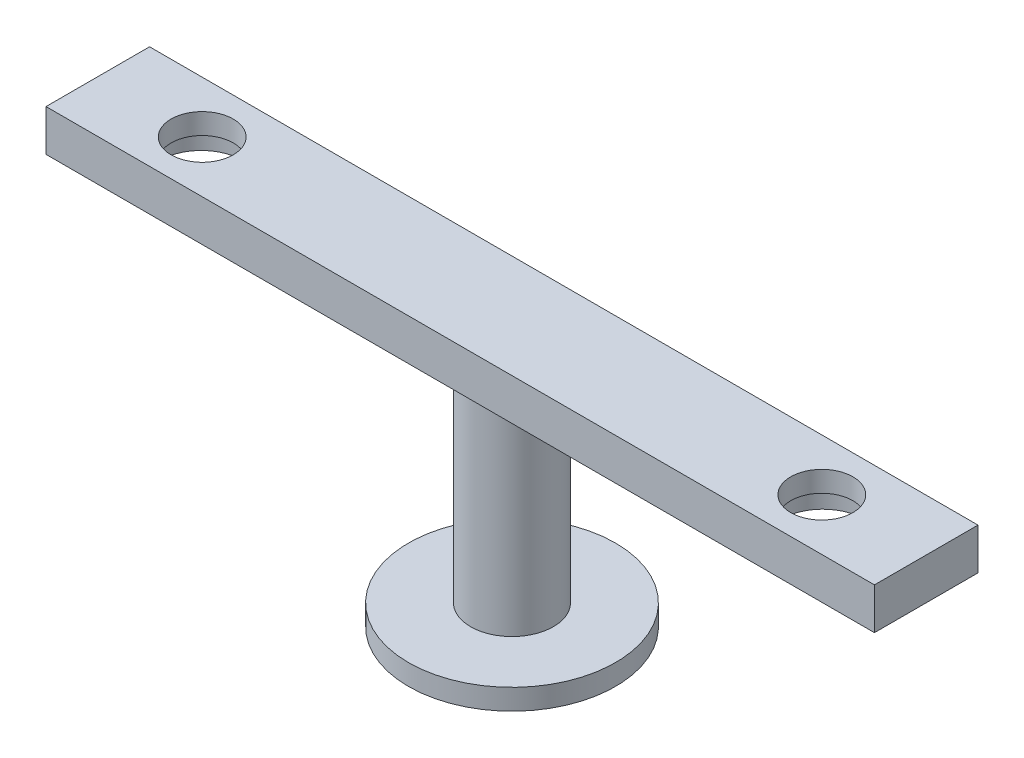
ISO-10303-21;
HEADER;
FILE_DESCRIPTION(('STEP AP214'),'2;1');
FILE_NAME('part.step','',(''),(''),'','','');
FILE_SCHEMA(('AUTOMOTIVE_DESIGN { 1 0 10303 214 1 1 1 1 }'));
ENDSEC;
DATA;
#1=APPLICATION_CONTEXT('core data for automotive mechanical design processes');
#2=APPLICATION_PROTOCOL_DEFINITION('international standard','automotive_design',2000,#1);
#3=PRODUCT_CONTEXT('',#1,'mechanical');
#4=PRODUCT('Part','Part','',(#3));
#5=PRODUCT_RELATED_PRODUCT_CATEGORY('part','',(#4));
#6=PRODUCT_DEFINITION_FORMATION('','',#4);
#7=PRODUCT_DEFINITION_CONTEXT('part definition',#1,'design');
#8=PRODUCT_DEFINITION('design','',#6,#7);
#9=PRODUCT_DEFINITION_SHAPE('','',#8);
#10=(LENGTH_UNIT() NAMED_UNIT(*) SI_UNIT(.MILLI.,.METRE.));
#11=(NAMED_UNIT(*) PLANE_ANGLE_UNIT() SI_UNIT($,.RADIAN.));
#12=(NAMED_UNIT(*) SI_UNIT($,.STERADIAN.) SOLID_ANGLE_UNIT());
#13=UNCERTAINTY_MEASURE_WITH_UNIT(LENGTH_MEASURE(1.E-05),#10,'distance_accuracy_value','');
#14=(GEOMETRIC_REPRESENTATION_CONTEXT(3) GLOBAL_UNCERTAINTY_ASSIGNED_CONTEXT((#13)) GLOBAL_UNIT_ASSIGNED_CONTEXT((#10,
#11,#12)) REPRESENTATION_CONTEXT('',''));
#15=CARTESIAN_POINT('',(0.,0.,0.));
#16=DIRECTION('',(0.,0.,1.));
#17=DIRECTION('',(1.,0.,0.));
#18=AXIS2_PLACEMENT_3D('',#15,#16,#17);
#19=CARTESIAN_POINT('',(0.,1.,0.));
#20=DIRECTION('',(0.,-1.,0.));
#21=DIRECTION('',(0.,0.,-1.));
#22=AXIS2_PLACEMENT_3D('',#19,#20,#21);
#23=CYLINDRICAL_SURFACE('',#22,5.);
#24=CARTESIAN_POINT('',(0.,1.,0.));
#25=DIRECTION('',(0.,1.,0.));
#26=DIRECTION('',(0.,0.,1.));
#27=AXIS2_PLACEMENT_3D('',#24,#25,#26);
#28=CIRCLE('',#27,5.);
#29=CARTESIAN_POINT('',(0.,1.,5.));
#30=VERTEX_POINT('',#29);
#31=EDGE_CURVE('E139',#30,#30,#28,.T.);
#32=ORIENTED_EDGE('',*,*,#31,.F.);
#33=EDGE_LOOP('',(#32));
#34=FACE_BOUND('',#33,.T.);
#35=CARTESIAN_POINT('',(0.,0.,0.));
#36=DIRECTION('',(0.,1.,0.));
#37=DIRECTION('',(0.,0.,1.));
#38=AXIS2_PLACEMENT_3D('',#35,#36,#37);
#39=CIRCLE('',#38,5.);
#40=CARTESIAN_POINT('',(0.,0.,5.));
#41=VERTEX_POINT('',#40);
#42=EDGE_CURVE('E138',#41,#41,#39,.T.);
#43=ORIENTED_EDGE('',*,*,#42,.T.);
#44=EDGE_LOOP('',(#43));
#45=FACE_BOUND('',#44,.T.);
#46=ADVANCED_FACE('F47',(#34,#45),#23,.T.);
#47=CARTESIAN_POINT('',(0.,1.,0.));
#48=DIRECTION('',(0.,1.,0.));
#49=DIRECTION('',(0.,0.,1.));
#50=AXIS2_PLACEMENT_3D('',#47,#48,#49);
#51=PLANE('',#50);
#52=CARTESIAN_POINT('',(0.,1.,0.));
#53=DIRECTION('',(0.,1.,0.));
#54=DIRECTION('',(0.,0.,1.));
#55=AXIS2_PLACEMENT_3D('',#52,#53,#54);
#56=CIRCLE('',#55,2.);
#57=CARTESIAN_POINT('',(0.,1.,2.));
#58=VERTEX_POINT('',#57);
#59=EDGE_CURVE('E11',#58,#58,#56,.T.);
#60=ORIENTED_EDGE('',*,*,#59,.F.);
#61=EDGE_LOOP('',(#60));
#62=FACE_BOUND('',#61,.T.);
#63=ORIENTED_EDGE('',*,*,#31,.T.);
#64=EDGE_LOOP('',(#63));
#65=FACE_BOUND('',#64,.T.);
#66=ADVANCED_FACE('F200',(#62,#65),#51,.T.);
#67=CARTESIAN_POINT('',(0.,0.,0.));
#68=DIRECTION('',(0.,1.,0.));
#69=DIRECTION('',(0.,0.,1.));
#70=AXIS2_PLACEMENT_3D('',#67,#68,#69);
#71=PLANE('',#70);
#72=CARTESIAN_POINT('',(0.,0.,0.));
#73=DIRECTION('',(0.,1.,0.));
#74=DIRECTION('',(0.,0.,1.));
#75=AXIS2_PLACEMENT_3D('',#72,#73,#74);
#76=CIRCLE('',#75,2.5);
#77=CARTESIAN_POINT('',(0.,0.,2.5));
#78=VERTEX_POINT('',#77);
#79=EDGE_CURVE('E56',#78,#78,#76,.F.);
#80=ORIENTED_EDGE('',*,*,#79,.F.);
#81=EDGE_LOOP('',(#80));
#82=FACE_BOUND('',#81,.T.);
#83=ORIENTED_EDGE('',*,*,#42,.F.);
#84=EDGE_LOOP('',(#83));
#85=FACE_BOUND('',#84,.T.);
#86=ADVANCED_FACE('F206',(#82,#85),#71,.F.);
#87=CARTESIAN_POINT('',(0.,-0.5,0.));
#88=DIRECTION('',(0.,-1.,0.));
#89=DIRECTION('',(0.,0.,-1.));
#90=AXIS2_PLACEMENT_3D('',#87,#88,#89);
#91=PLANE('',#90);
#92=CARTESIAN_POINT('',(0.,-0.5,0.));
#93=DIRECTION('',(0.,-1.,0.));
#94=DIRECTION('',(0.,0.,-1.));
#95=AXIS2_PLACEMENT_3D('',#92,#93,#94);
#96=CIRCLE('',#95,2.5);
#97=CARTESIAN_POINT('',(0.,-0.5,-2.5));
#98=VERTEX_POINT('',#97);
#99=EDGE_CURVE('E133',#98,#98,#96,.T.);
#100=ORIENTED_EDGE('',*,*,#99,.T.);
#101=EDGE_LOOP('',(#100));
#102=FACE_BOUND('',#101,.T.);
#103=CARTESIAN_POINT('',(0.,-0.5,0.));
#104=DIRECTION('',(0.,-1.,0.));
#105=DIRECTION('',(0.,0.,-1.));
#106=AXIS2_PLACEMENT_3D('',#103,#104,#105);
#107=CIRCLE('',#106,1.75);
#108=CARTESIAN_POINT('',(0.,-0.5,-1.75));
#109=VERTEX_POINT('',#108);
#110=EDGE_CURVE('E130',#109,#109,#107,.T.);
#111=ORIENTED_EDGE('',*,*,#110,.F.);
#112=EDGE_LOOP('',(#111));
#113=FACE_BOUND('',#112,.T.);
#114=ADVANCED_FACE('F213',(#102,#113),#91,.T.);
#115=CARTESIAN_POINT('',(0.,-0.5,0.));
#116=DIRECTION('',(0.,1.,0.));
#117=DIRECTION('',(0.,0.,1.));
#118=AXIS2_PLACEMENT_3D('',#115,#116,#117);
#119=CYLINDRICAL_SURFACE('',#118,2.5);
#120=ORIENTED_EDGE('',*,*,#99,.F.);
#121=EDGE_LOOP('',(#120));
#122=FACE_BOUND('',#121,.T.);
#123=ORIENTED_EDGE('',*,*,#79,.T.);
#124=EDGE_LOOP('',(#123));
#125=FACE_BOUND('',#124,.T.);
#126=ADVANCED_FACE('F219',(#122,#125),#119,.T.);
#127=CARTESIAN_POINT('',(0.,-0.5,0.));
#128=DIRECTION('',(0.,1.,0.));
#129=DIRECTION('',(0.,0.,1.));
#130=AXIS2_PLACEMENT_3D('',#127,#128,#129);
#131=CYLINDRICAL_SURFACE('',#130,1.75);
#132=ORIENTED_EDGE('',*,*,#110,.T.);
#133=EDGE_LOOP('',(#132));
#134=FACE_BOUND('',#133,.T.);
#135=CARTESIAN_POINT('',(0.,0.,0.));
#136=DIRECTION('',(0.,-1.,0.));
#137=DIRECTION('',(0.,0.,-1.));
#138=AXIS2_PLACEMENT_3D('',#135,#136,#137);
#139=CIRCLE('',#138,1.75);
#140=CARTESIAN_POINT('',(0.,0.,-1.75));
#141=VERTEX_POINT('',#140);
#142=EDGE_CURVE('E128',#141,#141,#139,.T.);
#143=ORIENTED_EDGE('',*,*,#142,.F.);
#144=EDGE_LOOP('',(#143));
#145=FACE_BOUND('',#144,.T.);
#146=ADVANCED_FACE('F225',(#134,#145),#131,.F.);
#147=ORIENTED_EDGE('',*,*,#142,.T.);
#148=EDGE_LOOP('',(#147));
#149=FACE_BOUND('',#148,.T.);
#150=ADVANCED_FACE('F215',(#149),#71,.F.);
#151=CARTESIAN_POINT('',(0.,11.,0.));
#152=DIRECTION('',(0.,-1.,0.));
#153=DIRECTION('',(0.,0.,-1.));
#154=AXIS2_PLACEMENT_3D('',#151,#152,#153);
#155=CYLINDRICAL_SURFACE('',#154,2.);
#156=CARTESIAN_POINT('',(0.,11.,0.));
#157=DIRECTION('',(0.,1.,0.));
#158=DIRECTION('',(0.,0.,1.));
#159=AXIS2_PLACEMENT_3D('',#156,#157,#158);
#160=CIRCLE('',#159,2.);
#161=CARTESIAN_POINT('',(0.,11.,2.));
#162=VERTEX_POINT('',#161);
#163=EDGE_CURVE('E126',#162,#162,#160,.T.);
#164=ORIENTED_EDGE('',*,*,#163,.F.);
#165=EDGE_LOOP('',(#164));
#166=FACE_BOUND('',#165,.T.);
#167=ORIENTED_EDGE('',*,*,#59,.T.);
#168=EDGE_LOOP('',(#167));
#169=FACE_BOUND('',#168,.T.);
#170=ADVANCED_FACE('F224',(#166,#169),#155,.T.);
#171=CARTESIAN_POINT('',(20.,13.,2.5));
#172=DIRECTION('',(-1.,0.,0.));
#173=DIRECTION('',(0.,0.,1.));
#174=AXIS2_PLACEMENT_3D('',#171,#172,#173);
#175=PLANE('',#174);
#176=DIRECTION('',(0.,0.,-1.));
#177=VECTOR('',#176,1.);
#178=CARTESIAN_POINT('',(20.,11.,2.5));
#179=LINE('',#178,#177);
#180=CARTESIAN_POINT('',(20.,11.,2.5));
#181=VERTEX_POINT('',#180);
#182=CARTESIAN_POINT('',(20.,11.,-2.5));
#183=VERTEX_POINT('',#182);
#184=EDGE_CURVE('E116',#181,#183,#179,.T.);
#185=ORIENTED_EDGE('',*,*,#184,.T.);
#186=DIRECTION('',(0.,-1.,0.));
#187=VECTOR('',#186,1.);
#188=CARTESIAN_POINT('',(20.,13.,-2.5));
#189=LINE('',#188,#187);
#190=CARTESIAN_POINT('',(20.,13.,-2.5));
#191=VERTEX_POINT('',#190);
#192=EDGE_CURVE('E107',#191,#183,#189,.T.);
#193=ORIENTED_EDGE('',*,*,#192,.F.);
#194=DIRECTION('',(0.,0.,-1.));
#195=VECTOR('',#194,1.);
#196=CARTESIAN_POINT('',(20.,13.,2.5));
#197=LINE('',#196,#195);
#198=CARTESIAN_POINT('',(20.,13.,2.5));
#199=VERTEX_POINT('',#198);
#200=EDGE_CURVE('E101',#199,#191,#197,.T.);
#201=ORIENTED_EDGE('',*,*,#200,.F.);
#202=DIRECTION('',(0.,-1.,0.));
#203=VECTOR('',#202,1.);
#204=CARTESIAN_POINT('',(20.,13.,2.5));
#205=LINE('',#204,#203);
#206=EDGE_CURVE('E112',#199,#181,#205,.T.);
#207=ORIENTED_EDGE('',*,*,#206,.T.);
#208=EDGE_LOOP('',(#185,#193,#201,#207));
#209=FACE_BOUND('',#208,.T.);
#210=ADVANCED_FACE('F188',(#209),#175,.F.);
#211=CARTESIAN_POINT('',(20.,13.,-2.5));
#212=DIRECTION('',(0.,0.,1.));
#213=DIRECTION('',(1.,0.,0.));
#214=AXIS2_PLACEMENT_3D('',#211,#212,#213);
#215=PLANE('',#214);
#216=DIRECTION('',(-1.,0.,0.));
#217=VECTOR('',#216,1.);
#218=CARTESIAN_POINT('',(20.,11.,-2.5));
#219=LINE('',#218,#217);
#220=CARTESIAN_POINT('',(-20.,11.,-2.5));
#221=VERTEX_POINT('',#220);
#222=EDGE_CURVE('E106',#183,#221,#219,.T.);
#223=ORIENTED_EDGE('',*,*,#222,.T.);
#224=DIRECTION('',(0.,-1.,0.));
#225=VECTOR('',#224,1.);
#226=CARTESIAN_POINT('',(-20.,13.,-2.5));
#227=LINE('',#226,#225);
#228=CARTESIAN_POINT('',(-20.,13.,-2.5));
#229=VERTEX_POINT('',#228);
#230=EDGE_CURVE('E104',#229,#221,#227,.T.);
#231=ORIENTED_EDGE('',*,*,#230,.F.);
#232=DIRECTION('',(-1.,0.,0.));
#233=VECTOR('',#232,1.);
#234=CARTESIAN_POINT('',(20.,13.,-2.5));
#235=LINE('',#234,#233);
#236=EDGE_CURVE('E96',#191,#229,#235,.T.);
#237=ORIENTED_EDGE('',*,*,#236,.F.);
#238=ORIENTED_EDGE('',*,*,#192,.T.);
#239=EDGE_LOOP('',(#223,#231,#237,#238));
#240=FACE_BOUND('',#239,.T.);
#241=ADVANCED_FACE('F105',(#240),#215,.F.);
#242=CARTESIAN_POINT('',(-20.,13.,-2.5));
#243=DIRECTION('',(1.,0.,0.));
#244=DIRECTION('',(0.,0.,-1.));
#245=AXIS2_PLACEMENT_3D('',#242,#243,#244);
#246=PLANE('',#245);
#247=DIRECTION('',(0.,0.,1.));
#248=VECTOR('',#247,1.);
#249=CARTESIAN_POINT('',(-20.,11.,-2.5));
#250=LINE('',#249,#248);
#251=CARTESIAN_POINT('',(-20.,11.,2.5));
#252=VERTEX_POINT('',#251);
#253=EDGE_CURVE('E82',#221,#252,#250,.T.);
#254=ORIENTED_EDGE('',*,*,#253,.T.);
#255=DIRECTION('',(0.,-1.,0.));
#256=VECTOR('',#255,1.);
#257=CARTESIAN_POINT('',(-20.,13.,2.5));
#258=LINE('',#257,#256);
#259=CARTESIAN_POINT('',(-20.,13.,2.5));
#260=VERTEX_POINT('',#259);
#261=EDGE_CURVE('E108',#260,#252,#258,.T.);
#262=ORIENTED_EDGE('',*,*,#261,.F.);
#263=DIRECTION('',(0.,0.,1.));
#264=VECTOR('',#263,1.);
#265=CARTESIAN_POINT('',(-20.,13.,-2.5));
#266=LINE('',#265,#264);
#267=EDGE_CURVE('E99',#229,#260,#266,.T.);
#268=ORIENTED_EDGE('',*,*,#267,.F.);
#269=ORIENTED_EDGE('',*,*,#230,.T.);
#270=EDGE_LOOP('',(#254,#262,#268,#269));
#271=FACE_BOUND('',#270,.T.);
#272=ADVANCED_FACE('F110',(#271),#246,.F.);
#273=CARTESIAN_POINT('',(20.,13.,2.5));
#274=DIRECTION('',(0.,0.,-1.));
#275=DIRECTION('',(-1.,0.,0.));
#276=AXIS2_PLACEMENT_3D('',#273,#274,#275);
#277=PLANE('',#276);
#278=DIRECTION('',(1.,0.,0.));
#279=VECTOR('',#278,1.);
#280=CARTESIAN_POINT('',(20.,11.,2.5));
#281=LINE('',#280,#279);
#282=EDGE_CURVE('E88',#252,#181,#281,.T.);
#283=ORIENTED_EDGE('',*,*,#282,.T.);
#284=ORIENTED_EDGE('',*,*,#206,.F.);
#285=DIRECTION('',(1.,0.,0.));
#286=VECTOR('',#285,1.);
#287=CARTESIAN_POINT('',(20.,13.,2.5));
#288=LINE('',#287,#286);
#289=EDGE_CURVE('E65',#260,#199,#288,.T.);
#290=ORIENTED_EDGE('',*,*,#289,.F.);
#291=ORIENTED_EDGE('',*,*,#261,.T.);
#292=EDGE_LOOP('',(#283,#284,#290,#291));
#293=FACE_BOUND('',#292,.T.);
#294=ADVANCED_FACE('F189',(#293),#277,.F.);
#295=CARTESIAN_POINT('',(0.,13.,0.));
#296=DIRECTION('',(0.,1.,0.));
#297=DIRECTION('',(0.,0.,1.));
#298=AXIS2_PLACEMENT_3D('',#295,#296,#297);
#299=PLANE('',#298);
#300=CARTESIAN_POINT('',(-14.9595974000488,13.,0.));
#301=DIRECTION('',(0.,1.,0.));
#302=DIRECTION('',(0.,0.,1.));
#303=AXIS2_PLACEMENT_3D('',#300,#301,#302);
#304=CIRCLE('',#303,1.5);
#305=CARTESIAN_POINT('',(-14.9595974000488,13.,1.5));
#306=VERTEX_POINT('',#305);
#307=EDGE_CURVE('E50',#306,#306,#304,.T.);
#308=ORIENTED_EDGE('',*,*,#307,.F.);
#309=EDGE_LOOP('',(#308));
#310=FACE_BOUND('',#309,.T.);
#311=CARTESIAN_POINT('',(14.9595974000488,13.,0.));
#312=DIRECTION('',(0.,1.,0.));
#313=DIRECTION('',(0.,0.,1.));
#314=AXIS2_PLACEMENT_3D('',#311,#312,#313);
#315=CIRCLE('',#314,1.5);
#316=CARTESIAN_POINT('',(14.9595974000488,13.,1.5));
#317=VERTEX_POINT('',#316);
#318=EDGE_CURVE('E145',#317,#317,#315,.T.);
#319=ORIENTED_EDGE('',*,*,#318,.F.);
#320=EDGE_LOOP('',(#319));
#321=FACE_BOUND('',#320,.T.);
#322=ORIENTED_EDGE('',*,*,#200,.T.);
#323=ORIENTED_EDGE('',*,*,#236,.T.);
#324=ORIENTED_EDGE('',*,*,#267,.T.);
#325=ORIENTED_EDGE('',*,*,#289,.T.);
#326=EDGE_LOOP('',(#322,#323,#324,#325));
#327=FACE_BOUND('',#326,.T.);
#328=ADVANCED_FACE('F97',(#310,#321,#327),#299,.T.);
#329=CARTESIAN_POINT('',(0.,11.,0.));
#330=DIRECTION('',(0.,1.,0.));
#331=DIRECTION('',(0.,0.,1.));
#332=AXIS2_PLACEMENT_3D('',#329,#330,#331);
#333=PLANE('',#332);
#334=CARTESIAN_POINT('',(-15.,11.,0.));
#335=DIRECTION('',(0.,-1.,0.));
#336=DIRECTION('',(0.,0.,-1.));
#337=AXIS2_PLACEMENT_3D('',#334,#335,#336);
#338=CIRCLE('',#337,2.);
#339=CARTESIAN_POINT('',(-15.,11.,-2.));
#340=VERTEX_POINT('',#339);
#341=EDGE_CURVE('E162',#340,#340,#338,.T.);
#342=ORIENTED_EDGE('',*,*,#341,.F.);
#343=EDGE_LOOP('',(#342));
#344=FACE_BOUND('',#343,.T.);
#345=CARTESIAN_POINT('',(15.,11.,0.));
#346=DIRECTION('',(0.,-1.,0.));
#347=DIRECTION('',(0.,0.,1.));
#348=AXIS2_PLACEMENT_3D('',#345,#346,#347);
#349=CIRCLE('',#348,2.);
#350=CARTESIAN_POINT('',(15.,11.,2.));
#351=VERTEX_POINT('',#350);
#352=EDGE_CURVE('E165',#351,#351,#349,.T.);
#353=ORIENTED_EDGE('',*,*,#352,.F.);
#354=EDGE_LOOP('',(#353));
#355=FACE_BOUND('',#354,.T.);
#356=ORIENTED_EDGE('',*,*,#163,.T.);
#357=EDGE_LOOP('',(#356));
#358=FACE_BOUND('',#357,.T.);
#359=ORIENTED_EDGE('',*,*,#184,.F.);
#360=ORIENTED_EDGE('',*,*,#282,.F.);
#361=ORIENTED_EDGE('',*,*,#253,.F.);
#362=ORIENTED_EDGE('',*,*,#222,.F.);
#363=EDGE_LOOP('',(#359,#360,#361,#362));
#364=FACE_BOUND('',#363,.T.);
#365=ADVANCED_FACE('F176',(#344,#355,#358,#364),#333,.F.);
#366=CARTESIAN_POINT('',(15.,12.,0.));
#367=DIRECTION('',(0.,-1.,0.));
#368=DIRECTION('',(0.,0.,-1.));
#369=AXIS2_PLACEMENT_3D('',#366,#367,#368);
#370=CYLINDRICAL_SURFACE('',#369,2.);
#371=CARTESIAN_POINT('',(15.,12.,0.));
#372=DIRECTION('',(0.,-1.,0.));
#373=DIRECTION('',(0.,0.,1.));
#374=AXIS2_PLACEMENT_3D('',#371,#372,#373);
#375=CIRCLE('',#374,2.);
#376=CARTESIAN_POINT('',(15.,12.,2.));
#377=VERTEX_POINT('',#376);
#378=EDGE_CURVE('E151',#377,#377,#375,.T.);
#379=ORIENTED_EDGE('',*,*,#378,.F.);
#380=EDGE_LOOP('',(#379));
#381=FACE_BOUND('',#380,.T.);
#382=ORIENTED_EDGE('',*,*,#352,.T.);
#383=EDGE_LOOP('',(#382));
#384=FACE_BOUND('',#383,.T.);
#385=ADVANCED_FACE('F173',(#381,#384),#370,.F.);
#386=CARTESIAN_POINT('',(15.,12.,0.));
#387=DIRECTION('',(0.,1.,0.));
#388=DIRECTION('',(0.,0.,1.));
#389=AXIS2_PLACEMENT_3D('',#386,#387,#388);
#390=PLANE('',#389);
#391=CARTESIAN_POINT('',(14.9595974000488,12.,0.));
#392=DIRECTION('',(0.,-1.,0.));
#393=DIRECTION('',(0.,0.,1.));
#394=AXIS2_PLACEMENT_3D('',#391,#392,#393);
#395=CIRCLE('',#394,1.5);
#396=CARTESIAN_POINT('',(14.9595974000488,12.,1.5));
#397=VERTEX_POINT('',#396);
#398=EDGE_CURVE('E153',#397,#397,#395,.T.);
#399=ORIENTED_EDGE('',*,*,#398,.F.);
#400=EDGE_LOOP('',(#399));
#401=FACE_BOUND('',#400,.T.);
#402=ORIENTED_EDGE('',*,*,#378,.T.);
#403=EDGE_LOOP('',(#402));
#404=FACE_BOUND('',#403,.T.);
#405=ADVANCED_FACE('F171',(#401,#404),#390,.F.);
#406=CARTESIAN_POINT('',(-15.,12.,0.));
#407=DIRECTION('',(0.,-1.,0.));
#408=DIRECTION('',(0.,0.,-1.));
#409=AXIS2_PLACEMENT_3D('',#406,#407,#408);
#410=CYLINDRICAL_SURFACE('',#409,2.);
#411=CARTESIAN_POINT('',(-15.,12.,0.));
#412=DIRECTION('',(0.,-1.,0.));
#413=DIRECTION('',(0.,0.,-1.));
#414=AXIS2_PLACEMENT_3D('',#411,#412,#413);
#415=CIRCLE('',#414,2.);
#416=CARTESIAN_POINT('',(-15.,12.,-2.));
#417=VERTEX_POINT('',#416);
#418=EDGE_CURVE('E119',#417,#417,#415,.T.);
#419=ORIENTED_EDGE('',*,*,#418,.F.);
#420=EDGE_LOOP('',(#419));
#421=FACE_BOUND('',#420,.T.);
#422=ORIENTED_EDGE('',*,*,#341,.T.);
#423=EDGE_LOOP('',(#422));
#424=FACE_BOUND('',#423,.T.);
#425=ADVANCED_FACE('F289',(#421,#424),#410,.F.);
#426=CARTESIAN_POINT('',(-15.,12.,0.));
#427=DIRECTION('',(0.,-1.,0.));
#428=DIRECTION('',(0.,0.,-1.));
#429=AXIS2_PLACEMENT_3D('',#426,#427,#428);
#430=PLANE('',#429);
#431=CARTESIAN_POINT('',(-14.9595974000488,12.,0.));
#432=DIRECTION('',(0.,-1.,0.));
#433=DIRECTION('',(0.,0.,-1.));
#434=AXIS2_PLACEMENT_3D('',#431,#432,#433);
#435=CIRCLE('',#434,1.5);
#436=CARTESIAN_POINT('',(-14.9595974000488,12.,-1.5));
#437=VERTEX_POINT('',#436);
#438=EDGE_CURVE('E147',#437,#437,#435,.T.);
#439=ORIENTED_EDGE('',*,*,#438,.F.);
#440=EDGE_LOOP('',(#439));
#441=FACE_BOUND('',#440,.T.);
#442=ORIENTED_EDGE('',*,*,#418,.T.);
#443=EDGE_LOOP('',(#442));
#444=FACE_BOUND('',#443,.T.);
#445=ADVANCED_FACE('F299',(#441,#444),#430,.T.);
#446=CARTESIAN_POINT('',(14.9595974000488,43.,0.));
#447=DIRECTION('',(0.,-1.,0.));
#448=DIRECTION('',(0.,0.,-1.));
#449=AXIS2_PLACEMENT_3D('',#446,#447,#448);
#450=CYLINDRICAL_SURFACE('',#449,1.5);
#451=ORIENTED_EDGE('',*,*,#318,.T.);
#452=EDGE_LOOP('',(#451));
#453=FACE_BOUND('',#452,.T.);
#454=ORIENTED_EDGE('',*,*,#398,.T.);
#455=EDGE_LOOP('',(#454));
#456=FACE_BOUND('',#455,.T.);
#457=ADVANCED_FACE('F308',(#453,#456),#450,.F.);
#458=CARTESIAN_POINT('',(-14.9595974000488,43.,0.));
#459=DIRECTION('',(0.,-1.,0.));
#460=DIRECTION('',(0.,0.,-1.));
#461=AXIS2_PLACEMENT_3D('',#458,#459,#460);
#462=CYLINDRICAL_SURFACE('',#461,1.5);
#463=ORIENTED_EDGE('',*,*,#307,.T.);
#464=EDGE_LOOP('',(#463));
#465=FACE_BOUND('',#464,.T.);
#466=ORIENTED_EDGE('',*,*,#438,.T.);
#467=EDGE_LOOP('',(#466));
#468=FACE_BOUND('',#467,.T.);
#469=ADVANCED_FACE('F318',(#465,#468),#462,.F.);
#470=CLOSED_SHELL('',(#46,#66,#86,#114,#126,#146,#150,#170,#210,#241,#272,#294,#328,#365,#385,
#405,#425,#445,#457,#469));
#471=MANIFOLD_SOLID_BREP('B2',#470);
#472=ADVANCED_BREP_SHAPE_REPRESENTATION('',(#18,#471),#14);
#473=SHAPE_DEFINITION_REPRESENTATION(#9,#472);
ENDSEC;
END-ISO-10303-21;
